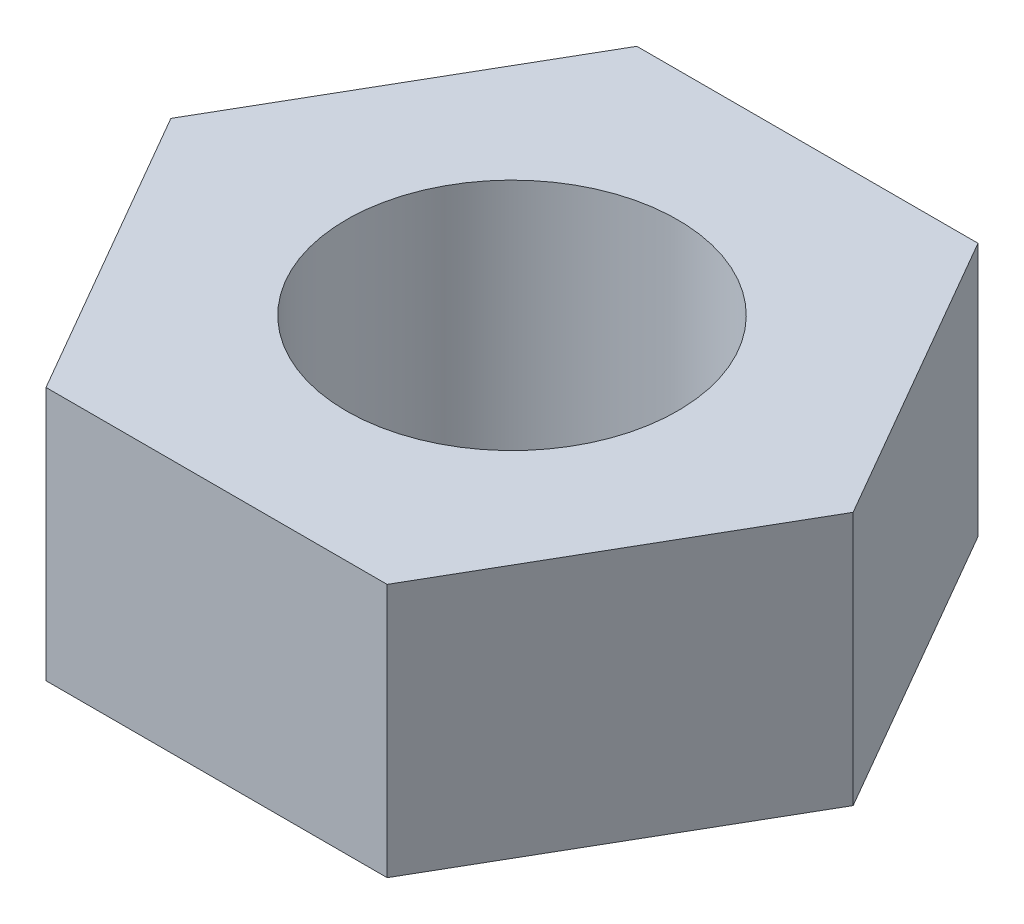
ISO-10303-21;
HEADER;
FILE_DESCRIPTION(('STEP AP214'),'2;1');
FILE_NAME('part.step','',(''),(''),'','','');
FILE_SCHEMA(('AUTOMOTIVE_DESIGN { 1 0 10303 214 1 1 1 1 }'));
ENDSEC;
DATA;
#1=APPLICATION_CONTEXT('core data for automotive mechanical design processes');
#2=APPLICATION_PROTOCOL_DEFINITION('international standard','automotive_design',2000,#1);
#3=PRODUCT_CONTEXT('',#1,'mechanical');
#4=PRODUCT('Part','Part','',(#3));
#5=PRODUCT_RELATED_PRODUCT_CATEGORY('part','',(#4));
#6=PRODUCT_DEFINITION_FORMATION('','',#4);
#7=PRODUCT_DEFINITION_CONTEXT('part definition',#1,'design');
#8=PRODUCT_DEFINITION('design','',#6,#7);
#9=PRODUCT_DEFINITION_SHAPE('','',#8);
#10=(LENGTH_UNIT() NAMED_UNIT(*) SI_UNIT(.MILLI.,.METRE.));
#11=(NAMED_UNIT(*) PLANE_ANGLE_UNIT() SI_UNIT($,.RADIAN.));
#12=(NAMED_UNIT(*) SI_UNIT($,.STERADIAN.) SOLID_ANGLE_UNIT());
#13=UNCERTAINTY_MEASURE_WITH_UNIT(LENGTH_MEASURE(1.E-05),#10,'distance_accuracy_value','');
#14=(GEOMETRIC_REPRESENTATION_CONTEXT(3) GLOBAL_UNCERTAINTY_ASSIGNED_CONTEXT((#13)) GLOBAL_UNIT_ASSIGNED_CONTEXT((#10,
#11,#12)) REPRESENTATION_CONTEXT('',''));
#15=CARTESIAN_POINT('',(0.,0.,0.));
#16=DIRECTION('',(0.,0.,1.));
#17=DIRECTION('',(1.,0.,0.));
#18=AXIS2_PLACEMENT_3D('',#15,#16,#17);
#19=CARTESIAN_POINT('',(1.54441197008228,2.3,2.67499999999998));
#20=DIRECTION('',(-0.866025403784441,0.,-0.499999999999995));
#21=DIRECTION('',(-0.499999999999995,0.,0.866025403784442));
#22=AXIS2_PLACEMENT_3D('',#19,#20,#21);
#23=PLANE('',#22);
#24=DIRECTION('',(0.499999999999995,0.,-0.866025403784442));
#25=VECTOR('',#24,1.);
#26=CARTESIAN_POINT('',(1.54441197008228,0.,2.67499999999998));
#27=LINE('',#26,#25);
#28=CARTESIAN_POINT('',(1.54441197008228,0.,2.67499999999998));
#29=VERTEX_POINT('',#28);
#30=CARTESIAN_POINT('',(3.0888239401645,0.,0.));
#31=VERTEX_POINT('',#30);
#32=EDGE_CURVE('E117',#29,#31,#27,.T.);
#33=ORIENTED_EDGE('',*,*,#32,.T.);
#34=DIRECTION('',(0.,-1.,0.));
#35=VECTOR('',#34,1.);
#36=CARTESIAN_POINT('',(3.0888239401645,2.3,0.));
#37=LINE('',#36,#35);
#38=CARTESIAN_POINT('',(3.0888239401645,2.3,0.));
#39=VERTEX_POINT('',#38);
#40=EDGE_CURVE('E11',#39,#31,#37,.T.);
#41=ORIENTED_EDGE('',*,*,#40,.F.);
#42=DIRECTION('',(0.499999999999995,0.,-0.866025403784442));
#43=VECTOR('',#42,1.);
#44=CARTESIAN_POINT('',(1.54441197008228,2.3,2.67499999999998));
#45=LINE('',#44,#43);
#46=CARTESIAN_POINT('',(1.54441197008228,2.3,2.67499999999998));
#47=VERTEX_POINT('',#46);
#48=EDGE_CURVE('E128',#47,#39,#45,.T.);
#49=ORIENTED_EDGE('',*,*,#48,.F.);
#50=DIRECTION('',(0.,-1.,0.));
#51=VECTOR('',#50,1.);
#52=CARTESIAN_POINT('',(1.54441197008228,2.3,2.67499999999998));
#53=LINE('',#52,#51);
#54=EDGE_CURVE('E113',#47,#29,#53,.T.);
#55=ORIENTED_EDGE('',*,*,#54,.T.);
#56=EDGE_LOOP('',(#33,#41,#49,#55));
#57=FACE_BOUND('',#56,.T.);
#58=ADVANCED_FACE('F33',(#57),#23,.F.);
#59=CARTESIAN_POINT('',(3.0888239401645,2.3,0.));
#60=DIRECTION('',(-0.866025403784438,0.,0.500000000000001));
#61=DIRECTION('',(0.500000000000001,0.,0.866025403784438));
#62=AXIS2_PLACEMENT_3D('',#59,#60,#61);
#63=PLANE('',#62);
#64=DIRECTION('',(-0.500000000000001,0.,-0.866025403784438));
#65=VECTOR('',#64,1.);
#66=CARTESIAN_POINT('',(3.0888239401645,0.,0.));
#67=LINE('',#66,#65);
#68=CARTESIAN_POINT('',(1.54441197008224,0.,-2.67500000000001));
#69=VERTEX_POINT('',#68);
#70=EDGE_CURVE('E120',#31,#69,#67,.T.);
#71=ORIENTED_EDGE('',*,*,#70,.T.);
#72=DIRECTION('',(0.,-1.,0.));
#73=VECTOR('',#72,1.);
#74=CARTESIAN_POINT('',(1.54441197008224,2.3,-2.67500000000001));
#75=LINE('',#74,#73);
#76=CARTESIAN_POINT('',(1.54441197008224,2.3,-2.67500000000001));
#77=VERTEX_POINT('',#76);
#78=EDGE_CURVE('E41',#77,#69,#75,.T.);
#79=ORIENTED_EDGE('',*,*,#78,.F.);
#80=DIRECTION('',(-0.500000000000001,0.,-0.866025403784438));
#81=VECTOR('',#80,1.);
#82=CARTESIAN_POINT('',(3.0888239401645,2.3,0.));
#83=LINE('',#82,#81);
#84=EDGE_CURVE('E86',#39,#77,#83,.T.);
#85=ORIENTED_EDGE('',*,*,#84,.F.);
#86=ORIENTED_EDGE('',*,*,#40,.T.);
#87=EDGE_LOOP('',(#71,#79,#85,#86));
#88=FACE_BOUND('',#87,.T.);
#89=ADVANCED_FACE('F153',(#88),#63,.F.);
#90=CARTESIAN_POINT('',(1.54441197008224,2.3,-2.67500000000001));
#91=DIRECTION('',(0.,0.,1.));
#92=DIRECTION('',(1.,0.,0.));
#93=AXIS2_PLACEMENT_3D('',#90,#91,#92);
#94=PLANE('',#93);
#95=DIRECTION('',(-1.,0.,0.));
#96=VECTOR('',#95,1.);
#97=CARTESIAN_POINT('',(1.54441197008224,0.,-2.67500000000001));
#98=LINE('',#97,#96);
#99=CARTESIAN_POINT('',(-1.54441197008226,0.,-2.67499999999999));
#100=VERTEX_POINT('',#99);
#101=EDGE_CURVE('E123',#69,#100,#98,.T.);
#102=ORIENTED_EDGE('',*,*,#101,.T.);
#103=DIRECTION('',(0.,-1.,0.));
#104=VECTOR('',#103,1.);
#105=CARTESIAN_POINT('',(-1.54441197008226,2.3,-2.67499999999999));
#106=LINE('',#105,#104);
#107=CARTESIAN_POINT('',(-1.54441197008226,2.3,-2.67499999999999));
#108=VERTEX_POINT('',#107);
#109=EDGE_CURVE('E108',#108,#100,#106,.T.);
#110=ORIENTED_EDGE('',*,*,#109,.F.);
#111=DIRECTION('',(-1.,0.,0.));
#112=VECTOR('',#111,1.);
#113=CARTESIAN_POINT('',(1.54441197008224,2.3,-2.67500000000001));
#114=LINE('',#113,#112);
#115=EDGE_CURVE('E99',#77,#108,#114,.T.);
#116=ORIENTED_EDGE('',*,*,#115,.F.);
#117=ORIENTED_EDGE('',*,*,#78,.T.);
#118=EDGE_LOOP('',(#102,#110,#116,#117));
#119=FACE_BOUND('',#118,.T.);
#120=ADVANCED_FACE('F134',(#119),#94,.F.);
#121=CARTESIAN_POINT('',(-1.54441197008226,2.3,-2.67499999999999));
#122=DIRECTION('',(0.866025403784442,0.,0.499999999999995));
#123=DIRECTION('',(0.499999999999995,0.,-0.866025403784442));
#124=AXIS2_PLACEMENT_3D('',#121,#122,#123);
#125=PLANE('',#124);
#126=DIRECTION('',(-0.499999999999995,0.,0.866025403784442));
#127=VECTOR('',#126,1.);
#128=CARTESIAN_POINT('',(-1.54441197008226,0.,-2.67499999999999));
#129=LINE('',#128,#127);
#130=CARTESIAN_POINT('',(-3.0888239401645,0.,0.));
#131=VERTEX_POINT('',#130);
#132=EDGE_CURVE('E107',#100,#131,#129,.T.);
#133=ORIENTED_EDGE('',*,*,#132,.T.);
#134=DIRECTION('',(0.,-1.,0.));
#135=VECTOR('',#134,1.);
#136=CARTESIAN_POINT('',(-3.0888239401645,2.3,0.));
#137=LINE('',#136,#135);
#138=CARTESIAN_POINT('',(-3.0888239401645,2.3,0.));
#139=VERTEX_POINT('',#138);
#140=EDGE_CURVE('E104',#139,#131,#137,.T.);
#141=ORIENTED_EDGE('',*,*,#140,.F.);
#142=DIRECTION('',(-0.499999999999995,0.,0.866025403784442));
#143=VECTOR('',#142,1.);
#144=CARTESIAN_POINT('',(-1.54441197008226,2.3,-2.67499999999999));
#145=LINE('',#144,#143);
#146=EDGE_CURVE('E93',#108,#139,#145,.T.);
#147=ORIENTED_EDGE('',*,*,#146,.F.);
#148=ORIENTED_EDGE('',*,*,#109,.T.);
#149=EDGE_LOOP('',(#133,#141,#147,#148));
#150=FACE_BOUND('',#149,.T.);
#151=ADVANCED_FACE('F105',(#150),#125,.F.);
#152=CARTESIAN_POINT('',(-3.0888239401645,2.3,0.));
#153=DIRECTION('',(0.866025403784435,0.,-0.500000000000007));
#154=DIRECTION('',(-0.500000000000007,0.,-0.866025403784435));
#155=AXIS2_PLACEMENT_3D('',#152,#153,#154);
#156=PLANE('',#155);
#157=DIRECTION('',(0.500000000000007,0.,0.866025403784435));
#158=VECTOR('',#157,1.);
#159=CARTESIAN_POINT('',(-3.0888239401645,0.,0.));
#160=LINE('',#159,#158);
#161=CARTESIAN_POINT('',(-1.54441197008222,0.,2.67500000000002));
#162=VERTEX_POINT('',#161);
#163=EDGE_CURVE('E72',#131,#162,#160,.T.);
#164=ORIENTED_EDGE('',*,*,#163,.T.);
#165=DIRECTION('',(0.,-1.,0.));
#166=VECTOR('',#165,1.);
#167=CARTESIAN_POINT('',(-1.54441197008222,2.3,2.67500000000002));
#168=LINE('',#167,#166);
#169=CARTESIAN_POINT('',(-1.54441197008222,2.3,2.67500000000002));
#170=VERTEX_POINT('',#169);
#171=EDGE_CURVE('E109',#170,#162,#168,.T.);
#172=ORIENTED_EDGE('',*,*,#171,.F.);
#173=DIRECTION('',(0.500000000000007,0.,0.866025403784435));
#174=VECTOR('',#173,1.);
#175=CARTESIAN_POINT('',(-3.0888239401645,2.3,0.));
#176=LINE('',#175,#174);
#177=EDGE_CURVE('E97',#139,#170,#176,.T.);
#178=ORIENTED_EDGE('',*,*,#177,.F.);
#179=ORIENTED_EDGE('',*,*,#140,.T.);
#180=EDGE_LOOP('',(#164,#172,#178,#179));
#181=FACE_BOUND('',#180,.T.);
#182=ADVANCED_FACE('F111',(#181),#156,.F.);
#183=CARTESIAN_POINT('',(-1.54441197008222,2.3,2.67500000000002));
#184=DIRECTION('',(0.,0.,-1.));
#185=DIRECTION('',(-1.,0.,0.));
#186=AXIS2_PLACEMENT_3D('',#183,#184,#185);
#187=PLANE('',#186);
#188=DIRECTION('',(1.,0.,0.));
#189=VECTOR('',#188,1.);
#190=CARTESIAN_POINT('',(-1.54441197008222,0.,2.67500000000002));
#191=LINE('',#190,#189);
#192=EDGE_CURVE('E78',#162,#29,#191,.T.);
#193=ORIENTED_EDGE('',*,*,#192,.T.);
#194=ORIENTED_EDGE('',*,*,#54,.F.);
#195=DIRECTION('',(1.,0.,0.));
#196=VECTOR('',#195,1.);
#197=CARTESIAN_POINT('',(-1.54441197008222,2.3,2.67500000000002));
#198=LINE('',#197,#196);
#199=EDGE_CURVE('E49',#170,#47,#198,.T.);
#200=ORIENTED_EDGE('',*,*,#199,.F.);
#201=ORIENTED_EDGE('',*,*,#171,.T.);
#202=EDGE_LOOP('',(#193,#194,#200,#201));
#203=FACE_BOUND('',#202,.T.);
#204=ADVANCED_FACE('F141',(#203),#187,.F.);
#205=CARTESIAN_POINT('',(0.,2.3,0.));
#206=DIRECTION('',(0.,1.,0.));
#207=DIRECTION('',(0.,0.,1.));
#208=AXIS2_PLACEMENT_3D('',#205,#206,#207);
#209=PLANE('',#208);
#210=CARTESIAN_POINT('',(0.,2.3,0.));
#211=DIRECTION('',(0.,1.,0.));
#212=DIRECTION('',(0.,0.,1.));
#213=AXIS2_PLACEMENT_3D('',#210,#211,#212);
#214=CIRCLE('',#213,1.5);
#215=CARTESIAN_POINT('',(0.,2.3,1.5));
#216=VERTEX_POINT('',#215);
#217=EDGE_CURVE('E208',#216,#216,#214,.T.);
#218=ORIENTED_EDGE('',*,*,#217,.F.);
#219=EDGE_LOOP('',(#218));
#220=FACE_BOUND('',#219,.T.);
#221=ORIENTED_EDGE('',*,*,#48,.T.);
#222=ORIENTED_EDGE('',*,*,#84,.T.);
#223=ORIENTED_EDGE('',*,*,#115,.T.);
#224=ORIENTED_EDGE('',*,*,#146,.T.);
#225=ORIENTED_EDGE('',*,*,#177,.T.);
#226=ORIENTED_EDGE('',*,*,#199,.T.);
#227=EDGE_LOOP('',(#221,#222,#223,#224,#225,#226));
#228=FACE_BOUND('',#227,.T.);
#229=ADVANCED_FACE('F95',(#220,#228),#209,.T.);
#230=CARTESIAN_POINT('',(0.,0.,0.));
#231=DIRECTION('',(0.,1.,0.));
#232=DIRECTION('',(0.,0.,1.));
#233=AXIS2_PLACEMENT_3D('',#230,#231,#232);
#234=PLANE('',#233);
#235=CARTESIAN_POINT('',(0.,0.,0.));
#236=DIRECTION('',(0.,1.,0.));
#237=DIRECTION('',(0.,0.,1.));
#238=AXIS2_PLACEMENT_3D('',#235,#236,#237);
#239=CIRCLE('',#238,1.5);
#240=CARTESIAN_POINT('',(0.,0.,1.5));
#241=VERTEX_POINT('',#240);
#242=EDGE_CURVE('E121',#241,#241,#239,.T.);
#243=ORIENTED_EDGE('',*,*,#242,.T.);
#244=EDGE_LOOP('',(#243));
#245=FACE_BOUND('',#244,.T.);
#246=ORIENTED_EDGE('',*,*,#32,.F.);
#247=ORIENTED_EDGE('',*,*,#192,.F.);
#248=ORIENTED_EDGE('',*,*,#163,.F.);
#249=ORIENTED_EDGE('',*,*,#132,.F.);
#250=ORIENTED_EDGE('',*,*,#101,.F.);
#251=ORIENTED_EDGE('',*,*,#70,.F.);
#252=EDGE_LOOP('',(#246,#247,#248,#249,#250,#251));
#253=FACE_BOUND('',#252,.T.);
#254=ADVANCED_FACE('F137',(#245,#253),#234,.F.);
#255=CARTESIAN_POINT('',(0.,0.,0.));
#256=DIRECTION('',(0.,1.,0.));
#257=DIRECTION('',(0.,0.,1.));
#258=AXIS2_PLACEMENT_3D('',#255,#256,#257);
#259=CYLINDRICAL_SURFACE('',#258,1.5);
#260=ORIENTED_EDGE('',*,*,#242,.F.);
#261=EDGE_LOOP('',(#260));
#262=FACE_BOUND('',#261,.T.);
#263=ORIENTED_EDGE('',*,*,#217,.T.);
#264=EDGE_LOOP('',(#263));
#265=FACE_BOUND('',#264,.T.);
#266=ADVANCED_FACE('F190',(#262,#265),#259,.F.);
#267=CLOSED_SHELL('',(#58,#89,#120,#151,#182,#204,#229,#254,#266));
#268=MANIFOLD_SOLID_BREP('B2',#267);
#269=ADVANCED_BREP_SHAPE_REPRESENTATION('',(#18,#268),#14);
#270=SHAPE_DEFINITION_REPRESENTATION(#9,#269);
ENDSEC;
END-ISO-10303-21;
